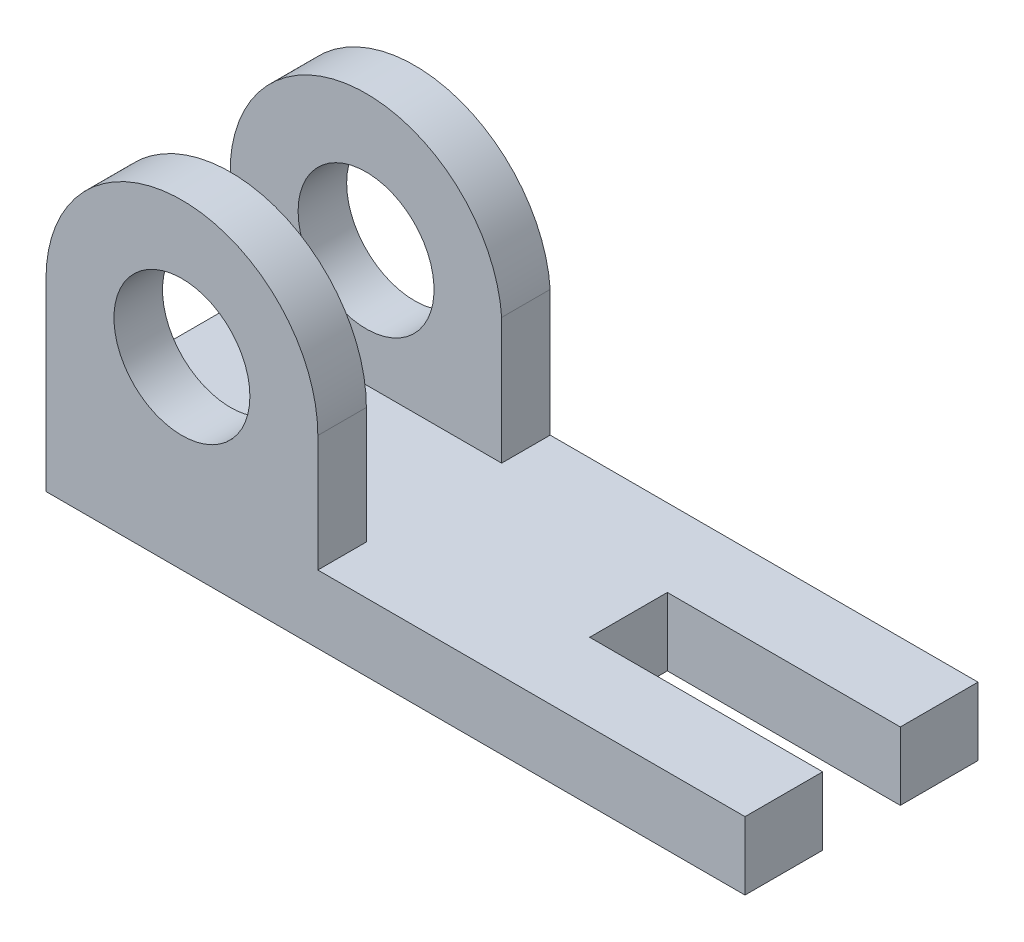
ISO-10303-21;
HEADER;
FILE_DESCRIPTION(('STEP AP214'),'2;1');
FILE_NAME('part.step','',(''),(''),'','','');
FILE_SCHEMA(('AUTOMOTIVE_DESIGN { 1 0 10303 214 1 1 1 1 }'));
ENDSEC;
DATA;
#1=APPLICATION_CONTEXT('core data for automotive mechanical design processes');
#2=APPLICATION_PROTOCOL_DEFINITION('international standard','automotive_design',2000,#1);
#3=PRODUCT_CONTEXT('',#1,'mechanical');
#4=PRODUCT('Part','Part','',(#3));
#5=PRODUCT_RELATED_PRODUCT_CATEGORY('part','',(#4));
#6=PRODUCT_DEFINITION_FORMATION('','',#4);
#7=PRODUCT_DEFINITION_CONTEXT('part definition',#1,'design');
#8=PRODUCT_DEFINITION('design','',#6,#7);
#9=PRODUCT_DEFINITION_SHAPE('','',#8);
#10=(LENGTH_UNIT() NAMED_UNIT(*) SI_UNIT(.MILLI.,.METRE.));
#11=(NAMED_UNIT(*) PLANE_ANGLE_UNIT() SI_UNIT($,.RADIAN.));
#12=(NAMED_UNIT(*) SI_UNIT($,.STERADIAN.) SOLID_ANGLE_UNIT());
#13=UNCERTAINTY_MEASURE_WITH_UNIT(LENGTH_MEASURE(1.E-05),#10,'distance_accuracy_value','');
#14=(GEOMETRIC_REPRESENTATION_CONTEXT(3) GLOBAL_UNCERTAINTY_ASSIGNED_CONTEXT((#13)) GLOBAL_UNIT_ASSIGNED_CONTEXT((#10,
#11,#12)) REPRESENTATION_CONTEXT('',''));
#15=CARTESIAN_POINT('',(0.,0.,0.));
#16=DIRECTION('',(0.,0.,1.));
#17=DIRECTION('',(1.,0.,0.));
#18=AXIS2_PLACEMENT_3D('',#15,#16,#17);
#19=CARTESIAN_POINT('',(-57.1500000000001,5.55625,19.05));
#20=DIRECTION('',(0.,-1.,0.));
#21=DIRECTION('',(0.,0.,-1.));
#22=AXIS2_PLACEMENT_3D('',#19,#20,#21);
#23=PLANE('',#22);
#24=DIRECTION('',(0.,0.,-1.));
#25=VECTOR('',#24,1.);
#26=CARTESIAN_POINT('',(-12.8040498607822,5.55625,-11.1125));
#27=LINE('',#26,#25);
#28=CARTESIAN_POINT('',(-12.8040498607822,5.55625,-11.1125));
#29=VERTEX_POINT('',#28);
#30=CARTESIAN_POINT('',(-12.8040498607822,5.55625,-19.05));
#31=VERTEX_POINT('',#30);
#32=EDGE_CURVE('E61',#29,#31,#27,.T.);
#33=ORIENTED_EDGE('',*,*,#32,.F.);
#34=DIRECTION('',(1.,0.,0.));
#35=VECTOR('',#34,1.);
#36=CARTESIAN_POINT('',(0.,5.55625,-11.1125));
#37=LINE('',#36,#35);
#38=CARTESIAN_POINT('',(-57.1500000000001,5.55625,-11.1125));
#39=VERTEX_POINT('',#38);
#40=EDGE_CURVE('E65',#39,#29,#37,.T.);
#41=ORIENTED_EDGE('',*,*,#40,.F.);
#42=DIRECTION('',(0.,0.,-1.));
#43=VECTOR('',#42,1.);
#44=CARTESIAN_POINT('',(-57.1500000000001,5.55625,19.05));
#45=LINE('',#44,#43);
#46=CARTESIAN_POINT('',(-57.1500000000001,5.55625,11.1125));
#47=VERTEX_POINT('',#46);
#48=EDGE_CURVE('E306',#47,#39,#45,.T.);
#49=ORIENTED_EDGE('',*,*,#48,.F.);
#50=DIRECTION('',(-1.,0.,0.));
#51=VECTOR('',#50,1.);
#52=CARTESIAN_POINT('',(0.,5.55625,11.1125));
#53=LINE('',#52,#51);
#54=CARTESIAN_POINT('',(-12.7000000000002,5.55625,11.1125));
#55=VERTEX_POINT('',#54);
#56=EDGE_CURVE('E203',#55,#47,#53,.T.);
#57=ORIENTED_EDGE('',*,*,#56,.F.);
#58=DIRECTION('',(0.,0.,1.));
#59=VECTOR('',#58,1.);
#60=CARTESIAN_POINT('',(-12.7000000000002,5.55625,11.1125));
#61=LINE('',#60,#59);
#62=CARTESIAN_POINT('',(-12.7000000000002,5.55625,19.05));
#63=VERTEX_POINT('',#62);
#64=EDGE_CURVE('E229',#55,#63,#61,.T.);
#65=ORIENTED_EDGE('',*,*,#64,.T.);
#66=DIRECTION('',(-1.,0.,0.));
#67=VECTOR('',#66,1.);
#68=CARTESIAN_POINT('',(-57.1500000000001,5.55625,19.05));
#69=LINE('',#68,#67);
#70=CARTESIAN_POINT('',(57.1499999999999,5.55625,19.05));
#71=VERTEX_POINT('',#70);
#72=EDGE_CURVE('E275',#71,#63,#69,.T.);
#73=ORIENTED_EDGE('',*,*,#72,.F.);
#74=DIRECTION('',(0.,0.,-1.));
#75=VECTOR('',#74,1.);
#76=CARTESIAN_POINT('',(57.1499999999999,5.55625,19.05));
#77=LINE('',#76,#75);
#78=CARTESIAN_POINT('',(57.1499999999999,5.55625,6.35));
#79=VERTEX_POINT('',#78);
#80=EDGE_CURVE('E11',#71,#79,#77,.T.);
#81=ORIENTED_EDGE('',*,*,#80,.T.);
#82=DIRECTION('',(1.,0.,0.));
#83=VECTOR('',#82,1.);
#84=CARTESIAN_POINT('',(19.0499999999999,5.55625,6.35));
#85=LINE('',#84,#83);
#86=CARTESIAN_POINT('',(19.0499999999999,5.55625,6.35));
#87=VERTEX_POINT('',#86);
#88=EDGE_CURVE('E265',#87,#79,#85,.T.);
#89=ORIENTED_EDGE('',*,*,#88,.F.);
#90=DIRECTION('',(0.,0.,1.));
#91=VECTOR('',#90,1.);
#92=CARTESIAN_POINT('',(19.0499999999999,5.55625,6.35));
#93=LINE('',#92,#91);
#94=CARTESIAN_POINT('',(19.0499999999999,5.55625,-6.35));
#95=VERTEX_POINT('',#94);
#96=EDGE_CURVE('E240',#95,#87,#93,.T.);
#97=ORIENTED_EDGE('',*,*,#96,.F.);
#98=DIRECTION('',(1.,0.,0.));
#99=VECTOR('',#98,1.);
#100=CARTESIAN_POINT('',(19.0499999999999,5.55625,-6.35));
#101=LINE('',#100,#99);
#102=CARTESIAN_POINT('',(57.1499999999999,5.55625,-6.35));
#103=VERTEX_POINT('',#102);
#104=EDGE_CURVE('E252',#95,#103,#101,.T.);
#105=ORIENTED_EDGE('',*,*,#104,.T.);
#106=CARTESIAN_POINT('',(57.1499999999999,5.55625,-19.05));
#107=VERTEX_POINT('',#106);
#108=EDGE_CURVE('E54',#103,#107,#77,.T.);
#109=ORIENTED_EDGE('',*,*,#108,.T.);
#110=DIRECTION('',(-1.,0.,0.));
#111=VECTOR('',#110,1.);
#112=CARTESIAN_POINT('',(-57.1500000000001,5.55625,-19.05));
#113=LINE('',#112,#111);
#114=EDGE_CURVE('E290',#107,#31,#113,.T.);
#115=ORIENTED_EDGE('',*,*,#114,.T.);
#116=EDGE_LOOP('',(#33,#41,#49,#57,#65,#73,#81,#89,#97,#105,#109,#115));
#117=FACE_BOUND('',#116,.T.);
#118=ADVANCED_FACE('F45',(#117),#23,.F.);
#119=CARTESIAN_POINT('',(57.1499999999999,5.55625,19.05));
#120=DIRECTION('',(-1.,0.,0.));
#121=DIRECTION('',(0.,0.,1.));
#122=AXIS2_PLACEMENT_3D('',#119,#120,#121);
#123=PLANE('',#122);
#124=ORIENTED_EDGE('',*,*,#108,.F.);
#125=DIRECTION('',(0.,1.,0.));
#126=VECTOR('',#125,1.);
#127=CARTESIAN_POINT('',(57.1499999999999,5.55625,-6.35));
#128=LINE('',#127,#126);
#129=CARTESIAN_POINT('',(57.1499999999999,-5.55625,-6.35));
#130=VERTEX_POINT('',#129);
#131=EDGE_CURVE('E228',#130,#103,#128,.T.);
#132=ORIENTED_EDGE('',*,*,#131,.F.);
#133=DIRECTION('',(0.,0.,-1.));
#134=VECTOR('',#133,1.);
#135=CARTESIAN_POINT('',(57.1499999999999,-5.55625,19.05));
#136=LINE('',#135,#134);
#137=CARTESIAN_POINT('',(57.1499999999999,-5.55625,-19.05));
#138=VERTEX_POINT('',#137);
#139=EDGE_CURVE('E286',#130,#138,#136,.T.);
#140=ORIENTED_EDGE('',*,*,#139,.T.);
#141=DIRECTION('',(0.,1.,0.));
#142=VECTOR('',#141,1.);
#143=CARTESIAN_POINT('',(57.1499999999999,5.55625,-19.05));
#144=LINE('',#143,#142);
#145=EDGE_CURVE('E260',#138,#107,#144,.T.);
#146=ORIENTED_EDGE('',*,*,#145,.T.);
#147=EDGE_LOOP('',(#124,#132,#140,#146));
#148=FACE_BOUND('',#147,.T.);
#149=ADVANCED_FACE('F321',(#148),#123,.F.);
#150=CARTESIAN_POINT('',(57.1499999999999,-5.55625,19.05));
#151=VERTEX_POINT('',#150);
#152=CARTESIAN_POINT('',(57.1499999999999,-5.55625,6.35));
#153=VERTEX_POINT('',#152);
#154=EDGE_CURVE('E299',#151,#153,#136,.T.);
#155=ORIENTED_EDGE('',*,*,#154,.T.);
#156=DIRECTION('',(0.,-1.,0.));
#157=VECTOR('',#156,1.);
#158=CARTESIAN_POINT('',(57.1499999999999,5.55625,6.35));
#159=LINE('',#158,#157);
#160=EDGE_CURVE('E241',#79,#153,#159,.T.);
#161=ORIENTED_EDGE('',*,*,#160,.F.);
#162=ORIENTED_EDGE('',*,*,#80,.F.);
#163=DIRECTION('',(0.,1.,0.));
#164=VECTOR('',#163,1.);
#165=CARTESIAN_POINT('',(57.1499999999999,5.55625,19.05));
#166=LINE('',#165,#164);
#167=EDGE_CURVE('E271',#151,#71,#166,.T.);
#168=ORIENTED_EDGE('',*,*,#167,.F.);
#169=EDGE_LOOP('',(#155,#161,#162,#168));
#170=FACE_BOUND('',#169,.T.);
#171=ADVANCED_FACE('F47',(#170),#123,.F.);
#172=CARTESIAN_POINT('',(-57.1500000000001,5.55625,19.05));
#173=DIRECTION('',(1.,0.,0.));
#174=DIRECTION('',(0.,0.,-1.));
#175=AXIS2_PLACEMENT_3D('',#172,#173,#174);
#176=PLANE('',#175);
#177=DIRECTION('',(0.,-1.,0.));
#178=VECTOR('',#177,1.);
#179=CARTESIAN_POINT('',(-57.1500000000001,5.55625,-19.05));
#180=LINE('',#179,#178);
#181=CARTESIAN_POINT('',(-57.1500000000001,26.195,-19.05));
#182=VERTEX_POINT('',#181);
#183=CARTESIAN_POINT('',(-57.1500000000001,-5.55625,-19.05));
#184=VERTEX_POINT('',#183);
#185=EDGE_CURVE('E293',#182,#184,#180,.T.);
#186=ORIENTED_EDGE('',*,*,#185,.T.);
#187=DIRECTION('',(0.,0.,-1.));
#188=VECTOR('',#187,1.);
#189=CARTESIAN_POINT('',(-57.1500000000001,-5.55625,19.05));
#190=LINE('',#189,#188);
#191=CARTESIAN_POINT('',(-57.1500000000001,-5.55625,19.05));
#192=VERTEX_POINT('',#191);
#193=EDGE_CURVE('E303',#192,#184,#190,.T.);
#194=ORIENTED_EDGE('',*,*,#193,.F.);
#195=DIRECTION('',(0.,-1.,0.));
#196=VECTOR('',#195,1.);
#197=CARTESIAN_POINT('',(-57.1500000000001,5.55625,19.05));
#198=LINE('',#197,#196);
#199=CARTESIAN_POINT('',(-57.1500000000002,24.60625,19.05));
#200=VERTEX_POINT('',#199);
#201=EDGE_CURVE('E280',#200,#192,#198,.T.);
#202=ORIENTED_EDGE('',*,*,#201,.F.);
#203=DIRECTION('',(0.,0.,1.));
#204=VECTOR('',#203,1.);
#205=CARTESIAN_POINT('',(-57.1500000000002,24.60625,11.1125));
#206=LINE('',#205,#204);
#207=CARTESIAN_POINT('',(-57.1500000000002,24.60625,11.1125));
#208=VERTEX_POINT('',#207);
#209=EDGE_CURVE('E214',#208,#200,#206,.T.);
#210=ORIENTED_EDGE('',*,*,#209,.F.);
#211=DIRECTION('',(0.,1.,0.));
#212=VECTOR('',#211,1.);
#213=CARTESIAN_POINT('',(-57.1500000000001,0.,11.1125));
#214=LINE('',#213,#212);
#215=EDGE_CURVE('E199',#47,#208,#214,.T.);
#216=ORIENTED_EDGE('',*,*,#215,.F.);
#217=ORIENTED_EDGE('',*,*,#48,.T.);
#218=DIRECTION('',(0.,1.,0.));
#219=VECTOR('',#218,1.);
#220=CARTESIAN_POINT('',(-57.1500000000001,0.,-11.1125));
#221=LINE('',#220,#219);
#222=CARTESIAN_POINT('',(-57.1500000000001,26.195,-11.1125));
#223=VERTEX_POINT('',#222);
#224=EDGE_CURVE('E180',#39,#223,#221,.T.);
#225=ORIENTED_EDGE('',*,*,#224,.T.);
#226=DIRECTION('',(0.,0.,-1.));
#227=VECTOR('',#226,1.);
#228=CARTESIAN_POINT('',(-57.1500000000001,26.195,-11.1125));
#229=LINE('',#228,#227);
#230=EDGE_CURVE('E169',#223,#182,#229,.T.);
#231=ORIENTED_EDGE('',*,*,#230,.T.);
#232=EDGE_LOOP('',(#186,#194,#202,#210,#216,#217,#225,#231));
#233=FACE_BOUND('',#232,.T.);
#234=ADVANCED_FACE('F329',(#233),#176,.F.);
#235=CARTESIAN_POINT('',(-57.1500000000001,-5.55625,19.05));
#236=DIRECTION('',(0.,1.,0.));
#237=DIRECTION('',(0.,0.,1.));
#238=AXIS2_PLACEMENT_3D('',#235,#236,#237);
#239=PLANE('',#238);
#240=ORIENTED_EDGE('',*,*,#139,.F.);
#241=DIRECTION('',(1.,0.,0.));
#242=VECTOR('',#241,1.);
#243=CARTESIAN_POINT('',(19.0499999999999,-5.55625,-6.35));
#244=LINE('',#243,#242);
#245=CARTESIAN_POINT('',(19.0499999999999,-5.55625,-6.35));
#246=VERTEX_POINT('',#245);
#247=EDGE_CURVE('E257',#246,#130,#244,.T.);
#248=ORIENTED_EDGE('',*,*,#247,.F.);
#249=DIRECTION('',(0.,0.,-1.));
#250=VECTOR('',#249,1.);
#251=CARTESIAN_POINT('',(19.0499999999999,-5.55625,6.35));
#252=LINE('',#251,#250);
#253=CARTESIAN_POINT('',(19.0499999999999,-5.55625,6.35));
#254=VERTEX_POINT('',#253);
#255=EDGE_CURVE('E248',#254,#246,#252,.T.);
#256=ORIENTED_EDGE('',*,*,#255,.F.);
#257=DIRECTION('',(1.,0.,0.));
#258=VECTOR('',#257,1.);
#259=CARTESIAN_POINT('',(19.0499999999999,-5.55625,6.35));
#260=LINE('',#259,#258);
#261=EDGE_CURVE('E261',#254,#153,#260,.T.);
#262=ORIENTED_EDGE('',*,*,#261,.T.);
#263=ORIENTED_EDGE('',*,*,#154,.F.);
#264=DIRECTION('',(1.,0.,0.));
#265=VECTOR('',#264,1.);
#266=CARTESIAN_POINT('',(-57.1500000000001,-5.55625,19.05));
#267=LINE('',#266,#265);
#268=EDGE_CURVE('E283',#192,#151,#267,.T.);
#269=ORIENTED_EDGE('',*,*,#268,.F.);
#270=ORIENTED_EDGE('',*,*,#193,.T.);
#271=DIRECTION('',(1.,0.,0.));
#272=VECTOR('',#271,1.);
#273=CARTESIAN_POINT('',(-57.1500000000001,-5.55625,-19.05));
#274=LINE('',#273,#272);
#275=EDGE_CURVE('E276',#184,#138,#274,.T.);
#276=ORIENTED_EDGE('',*,*,#275,.T.);
#277=EDGE_LOOP('',(#240,#248,#256,#262,#263,#269,#270,#276));
#278=FACE_BOUND('',#277,.T.);
#279=ADVANCED_FACE('F326',(#278),#239,.F.);
#280=CARTESIAN_POINT('',(0.,0.,19.05));
#281=DIRECTION('',(0.,0.,1.));
#282=DIRECTION('',(1.,0.,0.));
#283=AXIS2_PLACEMENT_3D('',#280,#281,#282);
#284=PLANE('',#283);
#285=ORIENTED_EDGE('',*,*,#167,.T.);
#286=ORIENTED_EDGE('',*,*,#72,.T.);
#287=DIRECTION('',(0.,1.,0.));
#288=VECTOR('',#287,1.);
#289=CARTESIAN_POINT('',(-12.7000000000002,0.,19.05));
#290=LINE('',#289,#288);
#291=CARTESIAN_POINT('',(-12.7000000000001,24.60625,19.05));
#292=VERTEX_POINT('',#291);
#293=EDGE_CURVE('E218',#63,#292,#290,.T.);
#294=ORIENTED_EDGE('',*,*,#293,.T.);
#295=CARTESIAN_POINT('',(-34.9250000000002,24.60625,19.05));
#296=DIRECTION('',(0.,0.,1.));
#297=DIRECTION('',(1.,0.,0.));
#298=AXIS2_PLACEMENT_3D('',#295,#296,#297);
#299=CIRCLE('',#298,22.225);
#300=EDGE_CURVE('E193',#200,#292,#299,.F.);
#301=ORIENTED_EDGE('',*,*,#300,.F.);
#302=ORIENTED_EDGE('',*,*,#201,.T.);
#303=ORIENTED_EDGE('',*,*,#268,.T.);
#304=EDGE_LOOP('',(#285,#286,#294,#301,#302,#303));
#305=FACE_BOUND('',#304,.T.);
#306=CARTESIAN_POINT('',(-34.9250000000002,24.60625,19.05));
#307=DIRECTION('',(0.,0.,1.));
#308=DIRECTION('',(1.,0.,0.));
#309=AXIS2_PLACEMENT_3D('',#306,#307,#308);
#310=CIRCLE('',#309,11.115);
#311=CARTESIAN_POINT('',(-23.8100000000002,24.60625,19.05));
#312=VERTEX_POINT('',#311);
#313=EDGE_CURVE('E200',#312,#312,#310,.T.);
#314=ORIENTED_EDGE('',*,*,#313,.F.);
#315=EDGE_LOOP('',(#314));
#316=FACE_BOUND('',#315,.T.);
#317=ADVANCED_FACE('F336',(#305,#316),#284,.T.);
#318=CARTESIAN_POINT('',(0.,0.,-19.05));
#319=DIRECTION('',(0.,0.,1.));
#320=DIRECTION('',(1.,0.,0.));
#321=AXIS2_PLACEMENT_3D('',#318,#319,#320);
#322=PLANE('',#321);
#323=ORIENTED_EDGE('',*,*,#145,.F.);
#324=ORIENTED_EDGE('',*,*,#275,.F.);
#325=ORIENTED_EDGE('',*,*,#185,.F.);
#326=CARTESIAN_POINT('',(-34.9770249303912,24.60375,-19.05));
#327=DIRECTION('',(0.,0.,-1.));
#328=DIRECTION('',(-1.,0.,0.));
#329=AXIS2_PLACEMENT_3D('',#326,#327,#328);
#330=CIRCLE('',#329,22.23);
#331=CARTESIAN_POINT('',(-12.8040498607822,26.195,-19.05));
#332=VERTEX_POINT('',#331);
#333=EDGE_CURVE('E186',#332,#182,#330,.F.);
#334=ORIENTED_EDGE('',*,*,#333,.F.);
#335=DIRECTION('',(0.,1.,0.));
#336=VECTOR('',#335,1.);
#337=CARTESIAN_POINT('',(-12.8040498607822,0.,-19.05));
#338=LINE('',#337,#336);
#339=EDGE_CURVE('E160',#31,#332,#338,.T.);
#340=ORIENTED_EDGE('',*,*,#339,.F.);
#341=ORIENTED_EDGE('',*,*,#114,.F.);
#342=EDGE_LOOP('',(#323,#324,#325,#334,#340,#341));
#343=FACE_BOUND('',#342,.T.);
#344=CARTESIAN_POINT('',(-34.9770249303912,24.60375,-19.05));
#345=DIRECTION('',(0.,0.,-1.));
#346=DIRECTION('',(-1.,0.,0.));
#347=AXIS2_PLACEMENT_3D('',#344,#345,#346);
#348=CIRCLE('',#347,11.1125);
#349=CARTESIAN_POINT('',(-46.0895249303912,24.60375,-19.05));
#350=VERTEX_POINT('',#349);
#351=EDGE_CURVE('E172',#350,#350,#348,.T.);
#352=ORIENTED_EDGE('',*,*,#351,.F.);
#353=EDGE_LOOP('',(#352));
#354=FACE_BOUND('',#353,.T.);
#355=ADVANCED_FACE('F318',(#343,#354),#322,.F.);
#356=CARTESIAN_POINT('',(19.0499999999999,5.55625,-6.35));
#357=DIRECTION('',(0.,0.,-1.));
#358=DIRECTION('',(-1.,0.,0.));
#359=AXIS2_PLACEMENT_3D('',#356,#357,#358);
#360=PLANE('',#359);
#361=ORIENTED_EDGE('',*,*,#131,.T.);
#362=ORIENTED_EDGE('',*,*,#104,.F.);
#363=DIRECTION('',(0.,1.,0.));
#364=VECTOR('',#363,1.);
#365=CARTESIAN_POINT('',(19.0499999999999,5.55625,-6.35));
#366=LINE('',#365,#364);
#367=EDGE_CURVE('E236',#246,#95,#366,.T.);
#368=ORIENTED_EDGE('',*,*,#367,.F.);
#369=ORIENTED_EDGE('',*,*,#247,.T.);
#370=EDGE_LOOP('',(#361,#362,#368,#369));
#371=FACE_BOUND('',#370,.T.);
#372=ADVANCED_FACE('F365',(#371),#360,.F.);
#373=CARTESIAN_POINT('',(19.0499999999999,5.55625,6.35));
#374=DIRECTION('',(0.,0.,1.));
#375=DIRECTION('',(1.,0.,0.));
#376=AXIS2_PLACEMENT_3D('',#373,#374,#375);
#377=PLANE('',#376);
#378=ORIENTED_EDGE('',*,*,#160,.T.);
#379=ORIENTED_EDGE('',*,*,#261,.F.);
#380=DIRECTION('',(0.,-1.,0.));
#381=VECTOR('',#380,1.);
#382=CARTESIAN_POINT('',(19.0499999999999,5.55625,6.35));
#383=LINE('',#382,#381);
#384=EDGE_CURVE('E245',#87,#254,#383,.T.);
#385=ORIENTED_EDGE('',*,*,#384,.F.);
#386=ORIENTED_EDGE('',*,*,#88,.T.);
#387=EDGE_LOOP('',(#378,#379,#385,#386));
#388=FACE_BOUND('',#387,.T.);
#389=ADVANCED_FACE('F370',(#388),#377,.F.);
#390=CARTESIAN_POINT('',(19.0499999999999,0.,0.));
#391=DIRECTION('',(1.,0.,0.));
#392=DIRECTION('',(0.,0.,-1.));
#393=AXIS2_PLACEMENT_3D('',#390,#391,#392);
#394=PLANE('',#393);
#395=ORIENTED_EDGE('',*,*,#367,.T.);
#396=ORIENTED_EDGE('',*,*,#96,.T.);
#397=ORIENTED_EDGE('',*,*,#384,.T.);
#398=ORIENTED_EDGE('',*,*,#255,.T.);
#399=EDGE_LOOP('',(#395,#396,#397,#398));
#400=FACE_BOUND('',#399,.T.);
#401=ADVANCED_FACE('F383',(#400),#394,.T.);
#402=CARTESIAN_POINT('',(-34.9250000000002,24.60625,11.1125));
#403=DIRECTION('',(0.,0.,1.));
#404=DIRECTION('',(1.,0.,0.));
#405=AXIS2_PLACEMENT_3D('',#402,#403,#404);
#406=CYLINDRICAL_SURFACE('',#405,22.225);
#407=ORIENTED_EDGE('',*,*,#300,.T.);
#408=DIRECTION('',(0.,0.,1.));
#409=VECTOR('',#408,1.);
#410=CARTESIAN_POINT('',(-12.7000000000001,24.60625,11.1125));
#411=LINE('',#410,#409);
#412=CARTESIAN_POINT('',(-12.7000000000001,24.60625,11.1125));
#413=VERTEX_POINT('',#412);
#414=EDGE_CURVE('E225',#413,#292,#411,.T.);
#415=ORIENTED_EDGE('',*,*,#414,.F.);
#416=CARTESIAN_POINT('',(-34.9250000000002,24.60625,11.1125));
#417=DIRECTION('',(0.,0.,1.));
#418=DIRECTION('',(1.,0.,0.));
#419=AXIS2_PLACEMENT_3D('',#416,#417,#418);
#420=CIRCLE('',#419,22.225);
#421=EDGE_CURVE('E196',#208,#413,#420,.F.);
#422=ORIENTED_EDGE('',*,*,#421,.F.);
#423=ORIENTED_EDGE('',*,*,#209,.T.);
#424=EDGE_LOOP('',(#407,#415,#422,#423));
#425=FACE_BOUND('',#424,.T.);
#426=ADVANCED_FACE('F394',(#425),#406,.T.);
#427=CARTESIAN_POINT('',(-12.7000000000002,0.,11.1125));
#428=DIRECTION('',(1.,0.,0.));
#429=DIRECTION('',(0.,1.,0.));
#430=AXIS2_PLACEMENT_3D('',#427,#428,#429);
#431=PLANE('',#430);
#432=ORIENTED_EDGE('',*,*,#293,.F.);
#433=ORIENTED_EDGE('',*,*,#64,.F.);
#434=DIRECTION('',(0.,1.,0.));
#435=VECTOR('',#434,1.);
#436=CARTESIAN_POINT('',(-12.7000000000002,0.,11.1125));
#437=LINE('',#436,#435);
#438=EDGE_CURVE('E206',#55,#413,#437,.T.);
#439=ORIENTED_EDGE('',*,*,#438,.T.);
#440=ORIENTED_EDGE('',*,*,#414,.T.);
#441=EDGE_LOOP('',(#432,#433,#439,#440));
#442=FACE_BOUND('',#441,.T.);
#443=ADVANCED_FACE('F414',(#442),#431,.T.);
#444=CARTESIAN_POINT('',(-34.9250000000002,24.60625,11.1125));
#445=DIRECTION('',(0.,0.,1.));
#446=DIRECTION('',(1.,0.,0.));
#447=AXIS2_PLACEMENT_3D('',#444,#445,#446);
#448=CYLINDRICAL_SURFACE('',#447,11.115);
#449=CARTESIAN_POINT('',(-34.9250000000002,24.60625,11.1125));
#450=DIRECTION('',(0.,0.,1.));
#451=DIRECTION('',(1.,0.,0.));
#452=AXIS2_PLACEMENT_3D('',#449,#450,#451);
#453=CIRCLE('',#452,11.115);
#454=CARTESIAN_POINT('',(-23.8100000000002,24.60625,11.1125));
#455=VERTEX_POINT('',#454);
#456=EDGE_CURVE('E210',#455,#455,#453,.T.);
#457=ORIENTED_EDGE('',*,*,#456,.F.);
#458=EDGE_LOOP('',(#457));
#459=FACE_BOUND('',#458,.T.);
#460=ORIENTED_EDGE('',*,*,#313,.T.);
#461=EDGE_LOOP('',(#460));
#462=FACE_BOUND('',#461,.T.);
#463=ADVANCED_FACE('F425',(#459,#462),#448,.F.);
#464=CARTESIAN_POINT('',(0.,0.,11.1125));
#465=DIRECTION('',(0.,0.,1.));
#466=DIRECTION('',(1.,0.,0.));
#467=AXIS2_PLACEMENT_3D('',#464,#465,#466);
#468=PLANE('',#467);
#469=ORIENTED_EDGE('',*,*,#421,.T.);
#470=ORIENTED_EDGE('',*,*,#438,.F.);
#471=ORIENTED_EDGE('',*,*,#56,.T.);
#472=ORIENTED_EDGE('',*,*,#215,.T.);
#473=EDGE_LOOP('',(#469,#470,#471,#472));
#474=FACE_BOUND('',#473,.T.);
#475=ORIENTED_EDGE('',*,*,#456,.T.);
#476=EDGE_LOOP('',(#475));
#477=FACE_BOUND('',#476,.T.);
#478=ADVANCED_FACE('F436',(#474,#477),#468,.F.);
#479=CARTESIAN_POINT('',(-34.9770249303912,24.60375,-11.1125));
#480=DIRECTION('',(0.,0.,-1.));
#481=DIRECTION('',(-1.,0.,0.));
#482=AXIS2_PLACEMENT_3D('',#479,#480,#481);
#483=CYLINDRICAL_SURFACE('',#482,22.23);
#484=ORIENTED_EDGE('',*,*,#333,.T.);
#485=ORIENTED_EDGE('',*,*,#230,.F.);
#486=CARTESIAN_POINT('',(-34.9770249303912,24.60375,-11.1125));
#487=DIRECTION('',(0.,0.,-1.));
#488=DIRECTION('',(-1.,0.,0.));
#489=AXIS2_PLACEMENT_3D('',#486,#487,#488);
#490=CIRCLE('',#489,22.23);
#491=CARTESIAN_POINT('',(-12.8040498607822,26.195,-11.1125));
#492=VERTEX_POINT('',#491);
#493=EDGE_CURVE('E151',#492,#223,#490,.F.);
#494=ORIENTED_EDGE('',*,*,#493,.F.);
#495=DIRECTION('',(0.,0.,-1.));
#496=VECTOR('',#495,1.);
#497=CARTESIAN_POINT('',(-12.8040498607822,26.195,-11.1125));
#498=LINE('',#497,#496);
#499=EDGE_CURVE('E157',#492,#332,#498,.T.);
#500=ORIENTED_EDGE('',*,*,#499,.T.);
#501=EDGE_LOOP('',(#484,#485,#494,#500));
#502=FACE_BOUND('',#501,.T.);
#503=ADVANCED_FACE('F167',(#502),#483,.T.);
#504=CARTESIAN_POINT('',(-12.8040498607822,0.,-11.1125));
#505=DIRECTION('',(-1.,0.,0.));
#506=DIRECTION('',(0.,0.,1.));
#507=AXIS2_PLACEMENT_3D('',#504,#505,#506);
#508=PLANE('',#507);
#509=ORIENTED_EDGE('',*,*,#339,.T.);
#510=ORIENTED_EDGE('',*,*,#499,.F.);
#511=DIRECTION('',(0.,1.,0.));
#512=VECTOR('',#511,1.);
#513=CARTESIAN_POINT('',(-12.8040498607822,0.,-11.1125));
#514=LINE('',#513,#512);
#515=EDGE_CURVE('E145',#29,#492,#514,.T.);
#516=ORIENTED_EDGE('',*,*,#515,.F.);
#517=ORIENTED_EDGE('',*,*,#32,.T.);
#518=EDGE_LOOP('',(#509,#510,#516,#517));
#519=FACE_BOUND('',#518,.T.);
#520=ADVANCED_FACE('F158',(#519),#508,.F.);
#521=CARTESIAN_POINT('',(-34.9770249303912,24.60375,-11.1125));
#522=DIRECTION('',(0.,0.,-1.));
#523=DIRECTION('',(-1.,0.,0.));
#524=AXIS2_PLACEMENT_3D('',#521,#522,#523);
#525=CYLINDRICAL_SURFACE('',#524,11.1125);
#526=CARTESIAN_POINT('',(-34.9770249303912,24.60375,-11.1125));
#527=DIRECTION('',(0.,0.,-1.));
#528=DIRECTION('',(-1.,0.,0.));
#529=AXIS2_PLACEMENT_3D('',#526,#527,#528);
#530=CIRCLE('',#529,11.1125);
#531=CARTESIAN_POINT('',(-46.0895249303912,24.60375,-11.1125));
#532=VERTEX_POINT('',#531);
#533=EDGE_CURVE('E165',#532,#532,#530,.T.);
#534=ORIENTED_EDGE('',*,*,#533,.F.);
#535=EDGE_LOOP('',(#534));
#536=FACE_BOUND('',#535,.T.);
#537=ORIENTED_EDGE('',*,*,#351,.T.);
#538=EDGE_LOOP('',(#537));
#539=FACE_BOUND('',#538,.T.);
#540=ADVANCED_FACE('F483',(#536,#539),#525,.F.);
#541=CARTESIAN_POINT('',(0.,0.,-11.1125));
#542=DIRECTION('',(0.,0.,-1.));
#543=DIRECTION('',(-1.,0.,0.));
#544=AXIS2_PLACEMENT_3D('',#541,#542,#543);
#545=PLANE('',#544);
#546=ORIENTED_EDGE('',*,*,#493,.T.);
#547=ORIENTED_EDGE('',*,*,#224,.F.);
#548=ORIENTED_EDGE('',*,*,#40,.T.);
#549=ORIENTED_EDGE('',*,*,#515,.T.);
#550=EDGE_LOOP('',(#546,#547,#548,#549));
#551=FACE_BOUND('',#550,.T.);
#552=ORIENTED_EDGE('',*,*,#533,.T.);
#553=EDGE_LOOP('',(#552));
#554=FACE_BOUND('',#553,.T.);
#555=ADVANCED_FACE('F147',(#551,#554),#545,.F.);
#556=CLOSED_SHELL('',(#118,#149,#171,#234,#279,#317,#355,#372,#389,#401,#426,#443,#463,#478,
#503,#520,#540,#555));
#557=MANIFOLD_SOLID_BREP('B2',#556);
#558=ADVANCED_BREP_SHAPE_REPRESENTATION('',(#18,#557),#14);
#559=SHAPE_DEFINITION_REPRESENTATION(#9,#558);
ENDSEC;
END-ISO-10303-21;
